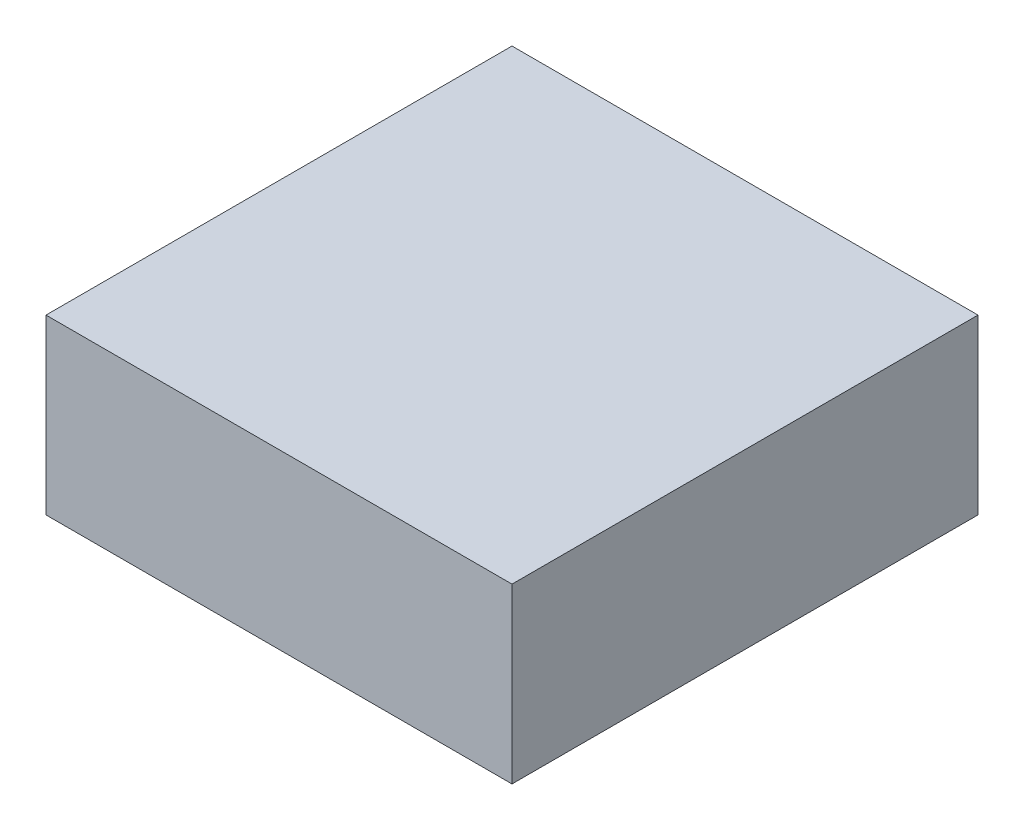
ISO-10303-21;
HEADER;
FILE_DESCRIPTION(('STEP AP214'),'2;1');
FILE_NAME('part.step','',(''),(''),'','','');
FILE_SCHEMA(('AUTOMOTIVE_DESIGN { 1 0 10303 214 1 1 1 1 }'));
ENDSEC;
DATA;
#1=APPLICATION_CONTEXT('core data for automotive mechanical design processes');
#2=APPLICATION_PROTOCOL_DEFINITION('international standard','automotive_design',2000,#1);
#3=PRODUCT_CONTEXT('',#1,'mechanical');
#4=PRODUCT('Part','Part','',(#3));
#5=PRODUCT_RELATED_PRODUCT_CATEGORY('part','',(#4));
#6=PRODUCT_DEFINITION_FORMATION('','',#4);
#7=PRODUCT_DEFINITION_CONTEXT('part definition',#1,'design');
#8=PRODUCT_DEFINITION('design','',#6,#7);
#9=PRODUCT_DEFINITION_SHAPE('','',#8);
#10=(LENGTH_UNIT() NAMED_UNIT(*) SI_UNIT(.MILLI.,.METRE.));
#11=(NAMED_UNIT(*) PLANE_ANGLE_UNIT() SI_UNIT($,.RADIAN.));
#12=(NAMED_UNIT(*) SI_UNIT($,.STERADIAN.) SOLID_ANGLE_UNIT());
#13=UNCERTAINTY_MEASURE_WITH_UNIT(LENGTH_MEASURE(1.E-05),#10,'distance_accuracy_value','');
#14=(GEOMETRIC_REPRESENTATION_CONTEXT(3) GLOBAL_UNCERTAINTY_ASSIGNED_CONTEXT((#13)) GLOBAL_UNIT_ASSIGNED_CONTEXT((#10,
#11,#12)) REPRESENTATION_CONTEXT('',''));
#15=CARTESIAN_POINT('',(0.,0.,0.));
#16=DIRECTION('',(0.,0.,1.));
#17=DIRECTION('',(1.,0.,0.));
#18=AXIS2_PLACEMENT_3D('',#15,#16,#17);
#19=CARTESIAN_POINT('',(-35.,26.,35.));
#20=DIRECTION('',(1.,0.,0.));
#21=DIRECTION('',(0.,0.,-1.));
#22=AXIS2_PLACEMENT_3D('',#19,#20,#21);
#23=PLANE('',#22);
#24=DIRECTION('',(0.,0.,1.));
#25=VECTOR('',#24,1.);
#26=CARTESIAN_POINT('',(-35.,0.,35.));
#27=LINE('',#26,#25);
#28=CARTESIAN_POINT('',(-35.,0.,-35.));
#29=VERTEX_POINT('',#28);
#30=CARTESIAN_POINT('',(-35.,0.,35.));
#31=VERTEX_POINT('',#30);
#32=EDGE_CURVE('E95',#29,#31,#27,.T.);
#33=ORIENTED_EDGE('',*,*,#32,.T.);
#34=DIRECTION('',(0.,-1.,0.));
#35=VECTOR('',#34,1.);
#36=CARTESIAN_POINT('',(-35.,26.,35.));
#37=LINE('',#36,#35);
#38=CARTESIAN_POINT('',(-35.,26.,35.));
#39=VERTEX_POINT('',#38);
#40=EDGE_CURVE('E11',#39,#31,#37,.T.);
#41=ORIENTED_EDGE('',*,*,#40,.F.);
#42=DIRECTION('',(0.,0.,1.));
#43=VECTOR('',#42,1.);
#44=CARTESIAN_POINT('',(-35.,26.,35.));
#45=LINE('',#44,#43);
#46=CARTESIAN_POINT('',(-35.,26.,-35.));
#47=VERTEX_POINT('',#46);
#48=EDGE_CURVE('E83',#47,#39,#45,.T.);
#49=ORIENTED_EDGE('',*,*,#48,.F.);
#50=DIRECTION('',(0.,-1.,0.));
#51=VECTOR('',#50,1.);
#52=CARTESIAN_POINT('',(-35.,26.,-35.));
#53=LINE('',#52,#51);
#54=EDGE_CURVE('E91',#47,#29,#53,.T.);
#55=ORIENTED_EDGE('',*,*,#54,.T.);
#56=EDGE_LOOP('',(#33,#41,#49,#55));
#57=FACE_BOUND('',#56,.T.);
#58=ADVANCED_FACE('F32',(#57),#23,.F.);
#59=CARTESIAN_POINT('',(35.,26.,35.));
#60=DIRECTION('',(0.,0.,-1.));
#61=DIRECTION('',(-1.,0.,0.));
#62=AXIS2_PLACEMENT_3D('',#59,#60,#61);
#63=PLANE('',#62);
#64=DIRECTION('',(1.,0.,0.));
#65=VECTOR('',#64,1.);
#66=CARTESIAN_POINT('',(35.,0.,35.));
#67=LINE('',#66,#65);
#68=CARTESIAN_POINT('',(35.,0.,35.));
#69=VERTEX_POINT('',#68);
#70=EDGE_CURVE('E87',#31,#69,#67,.T.);
#71=ORIENTED_EDGE('',*,*,#70,.T.);
#72=DIRECTION('',(0.,-1.,0.));
#73=VECTOR('',#72,1.);
#74=CARTESIAN_POINT('',(35.,26.,35.));
#75=LINE('',#74,#73);
#76=CARTESIAN_POINT('',(35.,26.,35.));
#77=VERTEX_POINT('',#76);
#78=EDGE_CURVE('E40',#77,#69,#75,.T.);
#79=ORIENTED_EDGE('',*,*,#78,.F.);
#80=DIRECTION('',(1.,0.,0.));
#81=VECTOR('',#80,1.);
#82=CARTESIAN_POINT('',(35.,26.,35.));
#83=LINE('',#82,#81);
#84=EDGE_CURVE('E78',#39,#77,#83,.T.);
#85=ORIENTED_EDGE('',*,*,#84,.F.);
#86=ORIENTED_EDGE('',*,*,#40,.T.);
#87=EDGE_LOOP('',(#71,#79,#85,#86));
#88=FACE_BOUND('',#87,.T.);
#89=ADVANCED_FACE('F86',(#88),#63,.F.);
#90=CARTESIAN_POINT('',(35.,26.,35.));
#91=DIRECTION('',(-1.,0.,0.));
#92=DIRECTION('',(0.,0.,1.));
#93=AXIS2_PLACEMENT_3D('',#90,#91,#92);
#94=PLANE('',#93);
#95=DIRECTION('',(0.,0.,-1.));
#96=VECTOR('',#95,1.);
#97=CARTESIAN_POINT('',(35.,0.,35.));
#98=LINE('',#97,#96);
#99=CARTESIAN_POINT('',(35.,0.,-35.));
#100=VERTEX_POINT('',#99);
#101=EDGE_CURVE('E65',#69,#100,#98,.T.);
#102=ORIENTED_EDGE('',*,*,#101,.T.);
#103=DIRECTION('',(0.,-1.,0.));
#104=VECTOR('',#103,1.);
#105=CARTESIAN_POINT('',(35.,26.,-35.));
#106=LINE('',#105,#104);
#107=CARTESIAN_POINT('',(35.,26.,-35.));
#108=VERTEX_POINT('',#107);
#109=EDGE_CURVE('E88',#108,#100,#106,.T.);
#110=ORIENTED_EDGE('',*,*,#109,.F.);
#111=DIRECTION('',(0.,0.,-1.));
#112=VECTOR('',#111,1.);
#113=CARTESIAN_POINT('',(35.,26.,35.));
#114=LINE('',#113,#112);
#115=EDGE_CURVE('E81',#77,#108,#114,.T.);
#116=ORIENTED_EDGE('',*,*,#115,.F.);
#117=ORIENTED_EDGE('',*,*,#78,.T.);
#118=EDGE_LOOP('',(#102,#110,#116,#117));
#119=FACE_BOUND('',#118,.T.);
#120=ADVANCED_FACE('F89',(#119),#94,.F.);
#121=CARTESIAN_POINT('',(35.,26.,-35.));
#122=DIRECTION('',(0.,0.,1.));
#123=DIRECTION('',(1.,0.,0.));
#124=AXIS2_PLACEMENT_3D('',#121,#122,#123);
#125=PLANE('',#124);
#126=DIRECTION('',(-1.,0.,0.));
#127=VECTOR('',#126,1.);
#128=CARTESIAN_POINT('',(35.,0.,-35.));
#129=LINE('',#128,#127);
#130=EDGE_CURVE('E71',#100,#29,#129,.T.);
#131=ORIENTED_EDGE('',*,*,#130,.T.);
#132=ORIENTED_EDGE('',*,*,#54,.F.);
#133=DIRECTION('',(-1.,0.,0.));
#134=VECTOR('',#133,1.);
#135=CARTESIAN_POINT('',(35.,26.,-35.));
#136=LINE('',#135,#134);
#137=EDGE_CURVE('E48',#108,#47,#136,.T.);
#138=ORIENTED_EDGE('',*,*,#137,.F.);
#139=ORIENTED_EDGE('',*,*,#109,.T.);
#140=EDGE_LOOP('',(#131,#132,#138,#139));
#141=FACE_BOUND('',#140,.T.);
#142=ADVANCED_FACE('F102',(#141),#125,.F.);
#143=CARTESIAN_POINT('',(0.,26.,0.));
#144=DIRECTION('',(0.,1.,0.));
#145=DIRECTION('',(0.,0.,1.));
#146=AXIS2_PLACEMENT_3D('',#143,#144,#145);
#147=PLANE('',#146);
#148=ORIENTED_EDGE('',*,*,#48,.T.);
#149=ORIENTED_EDGE('',*,*,#84,.T.);
#150=ORIENTED_EDGE('',*,*,#115,.T.);
#151=ORIENTED_EDGE('',*,*,#137,.T.);
#152=EDGE_LOOP('',(#148,#149,#150,#151));
#153=FACE_BOUND('',#152,.T.);
#154=ADVANCED_FACE('F79',(#153),#147,.T.);
#155=CARTESIAN_POINT('',(0.,0.,0.));
#156=DIRECTION('',(0.,1.,0.));
#157=DIRECTION('',(0.,0.,1.));
#158=AXIS2_PLACEMENT_3D('',#155,#156,#157);
#159=PLANE('',#158);
#160=ORIENTED_EDGE('',*,*,#32,.F.);
#161=ORIENTED_EDGE('',*,*,#130,.F.);
#162=ORIENTED_EDGE('',*,*,#101,.F.);
#163=ORIENTED_EDGE('',*,*,#70,.F.);
#164=EDGE_LOOP('',(#160,#161,#162,#163));
#165=FACE_BOUND('',#164,.T.);
#166=ADVANCED_FACE('F105',(#165),#159,.F.);
#167=CLOSED_SHELL('',(#58,#89,#120,#142,#154,#166));
#168=MANIFOLD_SOLID_BREP('B2',#167);
#169=ADVANCED_BREP_SHAPE_REPRESENTATION('',(#18,#168),#14);
#170=SHAPE_DEFINITION_REPRESENTATION(#9,#169);
ENDSEC;
END-ISO-10303-21;
